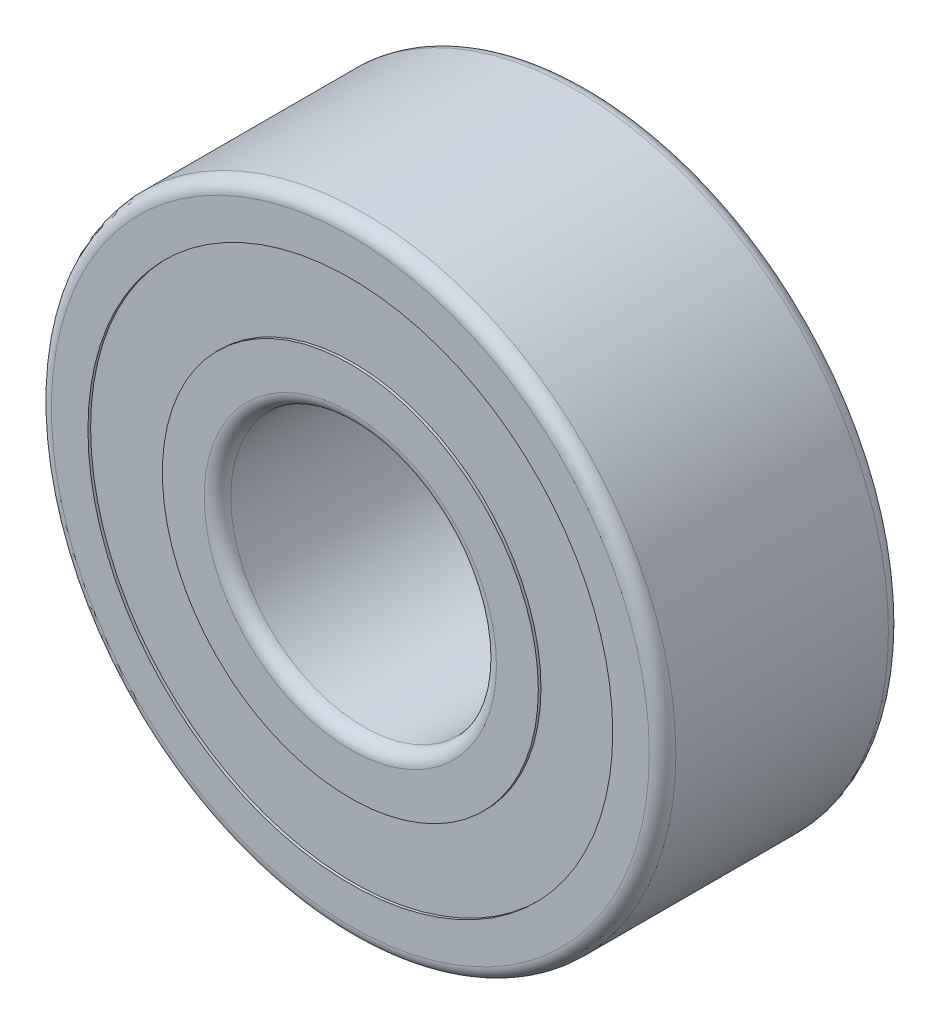
ISO-10303-21;
HEADER;
FILE_DESCRIPTION(('STEP AP214'),'2;1');
FILE_NAME('part.step','',(''),(''),'','','');
FILE_SCHEMA(('AUTOMOTIVE_DESIGN { 1 0 10303 214 1 1 1 1 }'));
ENDSEC;
DATA;
#1=APPLICATION_CONTEXT('core data for automotive mechanical design processes');
#2=APPLICATION_PROTOCOL_DEFINITION('international standard','automotive_design',2000,#1);
#3=PRODUCT_CONTEXT('',#1,'mechanical');
#4=PRODUCT('Part','Part','',(#3));
#5=PRODUCT_RELATED_PRODUCT_CATEGORY('part','',(#4));
#6=PRODUCT_DEFINITION_FORMATION('','',#4);
#7=PRODUCT_DEFINITION_CONTEXT('part definition',#1,'design');
#8=PRODUCT_DEFINITION('design','',#6,#7);
#9=PRODUCT_DEFINITION_SHAPE('','',#8);
#10=(LENGTH_UNIT() NAMED_UNIT(*) SI_UNIT(.MILLI.,.METRE.));
#11=(NAMED_UNIT(*) PLANE_ANGLE_UNIT() SI_UNIT($,.RADIAN.));
#12=(NAMED_UNIT(*) SI_UNIT($,.STERADIAN.) SOLID_ANGLE_UNIT());
#13=UNCERTAINTY_MEASURE_WITH_UNIT(LENGTH_MEASURE(1.E-05),#10,'distance_accuracy_value','');
#14=(GEOMETRIC_REPRESENTATION_CONTEXT(3) GLOBAL_UNCERTAINTY_ASSIGNED_CONTEXT((#13)) GLOBAL_UNIT_ASSIGNED_CONTEXT((#10,
#11,#12)) REPRESENTATION_CONTEXT('',''));
#15=CARTESIAN_POINT('',(0.,0.,0.));
#16=DIRECTION('',(0.,0.,1.));
#17=DIRECTION('',(1.,0.,0.));
#18=AXIS2_PLACEMENT_3D('',#15,#16,#17);
#19=CARTESIAN_POINT('',(0.,0.,0.));
#20=DIRECTION('',(0.,0.,1.));
#21=DIRECTION('',(1.,0.,0.));
#22=AXIS2_PLACEMENT_3D('',#19,#20,#21);
#23=PLANE('',#22);
#24=CARTESIAN_POINT('',(0.,0.,0.));
#25=DIRECTION('',(0.,0.,1.));
#26=DIRECTION('',(1.,0.,0.));
#27=AXIS2_PLACEMENT_3D('',#24,#25,#26);
#28=CIRCLE('',#27,11.);
#29=CARTESIAN_POINT('',(11.,0.,0.));
#30=VERTEX_POINT('',#29);
#31=EDGE_CURVE('E67',#30,#30,#28,.T.);
#32=ORIENTED_EDGE('',*,*,#31,.T.);
#33=EDGE_LOOP('',(#32));
#34=FACE_BOUND('',#33,.T.);
#35=CARTESIAN_POINT('',(0.,0.,0.));
#36=DIRECTION('',(0.,0.,1.));
#37=DIRECTION('',(1.,0.,0.));
#38=AXIS2_PLACEMENT_3D('',#35,#36,#37);
#39=CIRCLE('',#38,14.15);
#40=CARTESIAN_POINT('',(14.15,0.,0.));
#41=VERTEX_POINT('',#40);
#42=EDGE_CURVE('E92',#41,#41,#39,.T.);
#43=ORIENTED_EDGE('',*,*,#42,.F.);
#44=EDGE_LOOP('',(#43));
#45=FACE_BOUND('',#44,.T.);
#46=ADVANCED_FACE('F41',(#34,#45),#23,.F.);
#47=CARTESIAN_POINT('',(0.,0.,18.));
#48=DIRECTION('',(0.,0.,1.));
#49=DIRECTION('',(1.,0.,0.));
#50=AXIS2_PLACEMENT_3D('',#47,#48,#49);
#51=PLANE('',#50);
#52=CARTESIAN_POINT('',(0.,0.,18.));
#53=DIRECTION('',(0.,0.,1.));
#54=DIRECTION('',(1.,0.,0.));
#55=AXIS2_PLACEMENT_3D('',#52,#53,#54);
#56=CIRCLE('',#55,11.);
#57=CARTESIAN_POINT('',(11.,0.,18.));
#58=VERTEX_POINT('',#57);
#59=EDGE_CURVE('E52',#58,#58,#56,.F.);
#60=ORIENTED_EDGE('',*,*,#59,.T.);
#61=EDGE_LOOP('',(#60));
#62=FACE_BOUND('',#61,.T.);
#63=CARTESIAN_POINT('',(0.,0.,18.));
#64=DIRECTION('',(0.,0.,1.));
#65=DIRECTION('',(1.,0.,0.));
#66=AXIS2_PLACEMENT_3D('',#63,#64,#65);
#67=CIRCLE('',#66,14.15);
#68=CARTESIAN_POINT('',(14.15,0.,18.));
#69=VERTEX_POINT('',#68);
#70=EDGE_CURVE('E80',#69,#69,#67,.T.);
#71=ORIENTED_EDGE('',*,*,#70,.T.);
#72=EDGE_LOOP('',(#71));
#73=FACE_BOUND('',#72,.T.);
#74=ADVANCED_FACE('F108',(#62,#73),#51,.T.);
#75=CARTESIAN_POINT('',(0.,0.,18.));
#76=DIRECTION('',(0.,0.,1.));
#77=DIRECTION('',(1.,0.,0.));
#78=AXIS2_PLACEMENT_3D('',#75,#76,#77);
#79=CIRCLE('',#78,19.75);
#80=CARTESIAN_POINT('',(19.75,0.,18.));
#81=VERTEX_POINT('',#80);
#82=EDGE_CURVE('E74',#81,#81,#79,.T.);
#83=ORIENTED_EDGE('',*,*,#82,.F.);
#84=EDGE_LOOP('',(#83));
#85=FACE_BOUND('',#84,.T.);
#86=CARTESIAN_POINT('',(0.,0.,18.));
#87=DIRECTION('',(0.,0.,1.));
#88=DIRECTION('',(1.,0.,0.));
#89=AXIS2_PLACEMENT_3D('',#86,#87,#88);
#90=CIRCLE('',#89,22.5);
#91=CARTESIAN_POINT('',(22.5,0.,18.));
#92=VERTEX_POINT('',#91);
#93=EDGE_CURVE('E56',#92,#92,#90,.T.);
#94=ORIENTED_EDGE('',*,*,#93,.T.);
#95=EDGE_LOOP('',(#94));
#96=FACE_BOUND('',#95,.T.);
#97=ADVANCED_FACE('F117',(#85,#96),#51,.T.);
#98=CARTESIAN_POINT('',(0.,0.,0.));
#99=DIRECTION('',(0.,0.,1.));
#100=DIRECTION('',(1.,0.,0.));
#101=AXIS2_PLACEMENT_3D('',#98,#99,#100);
#102=CIRCLE('',#101,19.75);
#103=CARTESIAN_POINT('',(19.75,0.,0.));
#104=VERTEX_POINT('',#103);
#105=EDGE_CURVE('E86',#104,#104,#102,.T.);
#106=ORIENTED_EDGE('',*,*,#105,.T.);
#107=EDGE_LOOP('',(#106));
#108=FACE_BOUND('',#107,.T.);
#109=CARTESIAN_POINT('',(0.,0.,0.));
#110=DIRECTION('',(0.,0.,1.));
#111=DIRECTION('',(1.,0.,0.));
#112=AXIS2_PLACEMENT_3D('',#109,#110,#111);
#113=CIRCLE('',#112,22.5);
#114=CARTESIAN_POINT('',(22.5,0.,0.));
#115=VERTEX_POINT('',#114);
#116=EDGE_CURVE('E70',#115,#115,#113,.F.);
#117=ORIENTED_EDGE('',*,*,#116,.T.);
#118=EDGE_LOOP('',(#117));
#119=FACE_BOUND('',#118,.T.);
#120=ADVANCED_FACE('F111',(#108,#119),#23,.F.);
#121=CARTESIAN_POINT('',(0.,0.,18.));
#122=DIRECTION('',(0.,0.,-1.));
#123=DIRECTION('',(-1.,0.,0.));
#124=AXIS2_PLACEMENT_3D('',#121,#122,#123);
#125=CYLINDRICAL_SURFACE('',#124,23.5);
#126=CARTESIAN_POINT('',(0.,0.,1.));
#127=DIRECTION('',(0.,0.,1.));
#128=DIRECTION('',(1.,0.,0.));
#129=AXIS2_PLACEMENT_3D('',#126,#127,#128);
#130=CIRCLE('',#129,23.5);
#131=CARTESIAN_POINT('',(23.5,0.,1.));
#132=VERTEX_POINT('',#131);
#133=EDGE_CURVE('E10',#132,#132,#130,.T.);
#134=ORIENTED_EDGE('',*,*,#133,.T.);
#135=EDGE_LOOP('',(#134));
#136=FACE_BOUND('',#135,.T.);
#137=CARTESIAN_POINT('',(0.,0.,17.));
#138=DIRECTION('',(0.,0.,1.));
#139=DIRECTION('',(1.,0.,0.));
#140=AXIS2_PLACEMENT_3D('',#137,#138,#139);
#141=CIRCLE('',#140,23.5);
#142=CARTESIAN_POINT('',(23.5,0.,17.));
#143=VERTEX_POINT('',#142);
#144=EDGE_CURVE('E48',#143,#143,#141,.F.);
#145=ORIENTED_EDGE('',*,*,#144,.T.);
#146=EDGE_LOOP('',(#145));
#147=FACE_BOUND('',#146,.T.);
#148=ADVANCED_FACE('F121',(#136,#147),#125,.T.);
#149=CARTESIAN_POINT('',(0.,0.,18.));
#150=DIRECTION('',(0.,0.,-1.));
#151=DIRECTION('',(-1.,0.,0.));
#152=AXIS2_PLACEMENT_3D('',#149,#150,#151);
#153=CYLINDRICAL_SURFACE('',#152,10.);
#154=CARTESIAN_POINT('',(0.,0.,1.));
#155=DIRECTION('',(0.,0.,1.));
#156=DIRECTION('',(1.,0.,0.));
#157=AXIS2_PLACEMENT_3D('',#154,#155,#156);
#158=CIRCLE('',#157,10.);
#159=CARTESIAN_POINT('',(10.,0.,1.));
#160=VERTEX_POINT('',#159);
#161=EDGE_CURVE('E61',#160,#160,#158,.F.);
#162=ORIENTED_EDGE('',*,*,#161,.T.);
#163=EDGE_LOOP('',(#162));
#164=FACE_BOUND('',#163,.T.);
#165=CARTESIAN_POINT('',(0.,0.,17.));
#166=DIRECTION('',(0.,0.,1.));
#167=DIRECTION('',(1.,0.,0.));
#168=AXIS2_PLACEMENT_3D('',#165,#166,#167);
#169=CIRCLE('',#168,10.);
#170=CARTESIAN_POINT('',(10.,0.,17.));
#171=VERTEX_POINT('',#170);
#172=EDGE_CURVE('E64',#171,#171,#169,.T.);
#173=ORIENTED_EDGE('',*,*,#172,.T.);
#174=EDGE_LOOP('',(#173));
#175=FACE_BOUND('',#174,.T.);
#176=ADVANCED_FACE('F127',(#164,#175),#153,.F.);
#177=CARTESIAN_POINT('',(0.,0.,1.));
#178=DIRECTION('',(0.,0.,1.));
#179=DIRECTION('',(1.,0.,0.));
#180=AXIS2_PLACEMENT_3D('',#177,#178,#179);
#181=TOROIDAL_SURFACE('',#180,11.,1.);
#182=ORIENTED_EDGE('',*,*,#161,.F.);
#183=EDGE_LOOP('',(#182));
#184=FACE_BOUND('',#183,.T.);
#185=ORIENTED_EDGE('',*,*,#31,.F.);
#186=EDGE_LOOP('',(#185));
#187=FACE_BOUND('',#186,.T.);
#188=ADVANCED_FACE('F144',(#184,#187),#181,.T.);
#189=CARTESIAN_POINT('',(0.,0.,17.));
#190=DIRECTION('',(0.,0.,1.));
#191=DIRECTION('',(1.,0.,0.));
#192=AXIS2_PLACEMENT_3D('',#189,#190,#191);
#193=TOROIDAL_SURFACE('',#192,11.,1.);
#194=ORIENTED_EDGE('',*,*,#59,.F.);
#195=EDGE_LOOP('',(#194));
#196=FACE_BOUND('',#195,.T.);
#197=ORIENTED_EDGE('',*,*,#172,.F.);
#198=EDGE_LOOP('',(#197));
#199=FACE_BOUND('',#198,.T.);
#200=ADVANCED_FACE('F137',(#196,#199),#193,.T.);
#201=CARTESIAN_POINT('',(0.,0.,1.));
#202=DIRECTION('',(0.,0.,1.));
#203=DIRECTION('',(1.,0.,0.));
#204=AXIS2_PLACEMENT_3D('',#201,#202,#203);
#205=TOROIDAL_SURFACE('',#204,22.5,1.);
#206=ORIENTED_EDGE('',*,*,#116,.F.);
#207=EDGE_LOOP('',(#206));
#208=FACE_BOUND('',#207,.T.);
#209=ORIENTED_EDGE('',*,*,#133,.F.);
#210=EDGE_LOOP('',(#209));
#211=FACE_BOUND('',#210,.T.);
#212=ADVANCED_FACE('F134',(#208,#211),#205,.T.);
#213=CARTESIAN_POINT('',(0.,0.,17.));
#214=DIRECTION('',(0.,0.,1.));
#215=DIRECTION('',(1.,0.,0.));
#216=AXIS2_PLACEMENT_3D('',#213,#214,#215);
#217=TOROIDAL_SURFACE('',#216,22.5,1.);
#218=ORIENTED_EDGE('',*,*,#144,.F.);
#219=EDGE_LOOP('',(#218));
#220=FACE_BOUND('',#219,.T.);
#221=ORIENTED_EDGE('',*,*,#93,.F.);
#222=EDGE_LOOP('',(#221));
#223=FACE_BOUND('',#222,.T.);
#224=ADVANCED_FACE('F43',(#220,#223),#217,.T.);
#225=CARTESIAN_POINT('',(0.,0.,17.8));
#226=DIRECTION('',(0.,0.,1.));
#227=DIRECTION('',(1.,0.,0.));
#228=AXIS2_PLACEMENT_3D('',#225,#226,#227);
#229=CYLINDRICAL_SURFACE('',#228,19.75);
#230=CARTESIAN_POINT('',(0.,0.,17.8));
#231=DIRECTION('',(0.,0.,1.));
#232=DIRECTION('',(1.,0.,0.));
#233=AXIS2_PLACEMENT_3D('',#230,#231,#232);
#234=CIRCLE('',#233,19.75);
#235=CARTESIAN_POINT('',(19.75,0.,17.8));
#236=VERTEX_POINT('',#235);
#237=EDGE_CURVE('E73',#236,#236,#234,.T.);
#238=ORIENTED_EDGE('',*,*,#237,.F.);
#239=EDGE_LOOP('',(#238));
#240=FACE_BOUND('',#239,.T.);
#241=ORIENTED_EDGE('',*,*,#82,.T.);
#242=EDGE_LOOP('',(#241));
#243=FACE_BOUND('',#242,.T.);
#244=ADVANCED_FACE('F142',(#240,#243),#229,.F.);
#245=CARTESIAN_POINT('',(0.,0.,17.8));
#246=DIRECTION('',(0.,0.,1.));
#247=DIRECTION('',(1.,0.,0.));
#248=AXIS2_PLACEMENT_3D('',#245,#246,#247);
#249=PLANE('',#248);
#250=CARTESIAN_POINT('',(0.,0.,17.8));
#251=DIRECTION('',(0.,0.,1.));
#252=DIRECTION('',(1.,0.,0.));
#253=AXIS2_PLACEMENT_3D('',#250,#251,#252);
#254=CIRCLE('',#253,14.15);
#255=CARTESIAN_POINT('',(14.15,0.,17.8));
#256=VERTEX_POINT('',#255);
#257=EDGE_CURVE('E77',#256,#256,#254,.T.);
#258=ORIENTED_EDGE('',*,*,#257,.F.);
#259=EDGE_LOOP('',(#258));
#260=FACE_BOUND('',#259,.T.);
#261=ORIENTED_EDGE('',*,*,#237,.T.);
#262=EDGE_LOOP('',(#261));
#263=FACE_BOUND('',#262,.T.);
#264=ADVANCED_FACE('F166',(#260,#263),#249,.T.);
#265=CARTESIAN_POINT('',(0.,0.,17.8));
#266=DIRECTION('',(0.,0.,1.));
#267=DIRECTION('',(1.,0.,0.));
#268=AXIS2_PLACEMENT_3D('',#265,#266,#267);
#269=CYLINDRICAL_SURFACE('',#268,14.15);
#270=ORIENTED_EDGE('',*,*,#257,.T.);
#271=EDGE_LOOP('',(#270));
#272=FACE_BOUND('',#271,.T.);
#273=ORIENTED_EDGE('',*,*,#70,.F.);
#274=EDGE_LOOP('',(#273));
#275=FACE_BOUND('',#274,.T.);
#276=ADVANCED_FACE('F170',(#272,#275),#269,.T.);
#277=CARTESIAN_POINT('',(0.,0.,0.2));
#278=DIRECTION('',(0.,0.,1.));
#279=DIRECTION('',(1.,0.,0.));
#280=AXIS2_PLACEMENT_3D('',#277,#278,#279);
#281=PLANE('',#280);
#282=CARTESIAN_POINT('',(0.,0.,0.2));
#283=DIRECTION('',(0.,0.,1.));
#284=DIRECTION('',(1.,0.,0.));
#285=AXIS2_PLACEMENT_3D('',#282,#283,#284);
#286=CIRCLE('',#285,19.75);
#287=CARTESIAN_POINT('',(19.75,0.,0.2));
#288=VERTEX_POINT('',#287);
#289=EDGE_CURVE('E83',#288,#288,#286,.T.);
#290=ORIENTED_EDGE('',*,*,#289,.F.);
#291=EDGE_LOOP('',(#290));
#292=FACE_BOUND('',#291,.T.);
#293=CARTESIAN_POINT('',(0.,0.,0.2));
#294=DIRECTION('',(0.,0.,1.));
#295=DIRECTION('',(1.,0.,0.));
#296=AXIS2_PLACEMENT_3D('',#293,#294,#295);
#297=CIRCLE('',#296,14.15);
#298=CARTESIAN_POINT('',(14.15,0.,0.2));
#299=VERTEX_POINT('',#298);
#300=EDGE_CURVE('E89',#299,#299,#297,.T.);
#301=ORIENTED_EDGE('',*,*,#300,.T.);
#302=EDGE_LOOP('',(#301));
#303=FACE_BOUND('',#302,.T.);
#304=ADVANCED_FACE('F98',(#292,#303),#281,.F.);
#305=CARTESIAN_POINT('',(0.,0.,0.2));
#306=DIRECTION('',(0.,0.,-1.));
#307=DIRECTION('',(-1.,0.,0.));
#308=AXIS2_PLACEMENT_3D('',#305,#306,#307);
#309=CYLINDRICAL_SURFACE('',#308,19.75);
#310=ORIENTED_EDGE('',*,*,#289,.T.);
#311=EDGE_LOOP('',(#310));
#312=FACE_BOUND('',#311,.T.);
#313=ORIENTED_EDGE('',*,*,#105,.F.);
#314=EDGE_LOOP('',(#313));
#315=FACE_BOUND('',#314,.T.);
#316=ADVANCED_FACE('F103',(#312,#315),#309,.F.);
#317=CARTESIAN_POINT('',(0.,0.,0.2));
#318=DIRECTION('',(0.,0.,-1.));
#319=DIRECTION('',(-1.,0.,0.));
#320=AXIS2_PLACEMENT_3D('',#317,#318,#319);
#321=CYLINDRICAL_SURFACE('',#320,14.15);
#322=ORIENTED_EDGE('',*,*,#300,.F.);
#323=EDGE_LOOP('',(#322));
#324=FACE_BOUND('',#323,.T.);
#325=ORIENTED_EDGE('',*,*,#42,.T.);
#326=EDGE_LOOP('',(#325));
#327=FACE_BOUND('',#326,.T.);
#328=ADVANCED_FACE('F100',(#324,#327),#321,.T.);
#329=CLOSED_SHELL('',(#46,#74,#97,#120,#148,#176,#188,#200,#212,#224,#244,#264,#276,#304,#316,#328));
#330=MANIFOLD_SOLID_BREP('B2',#329);
#331=ADVANCED_BREP_SHAPE_REPRESENTATION('',(#18,#330),#14);
#332=SHAPE_DEFINITION_REPRESENTATION(#9,#331);
ENDSEC;
END-ISO-10303-21;
